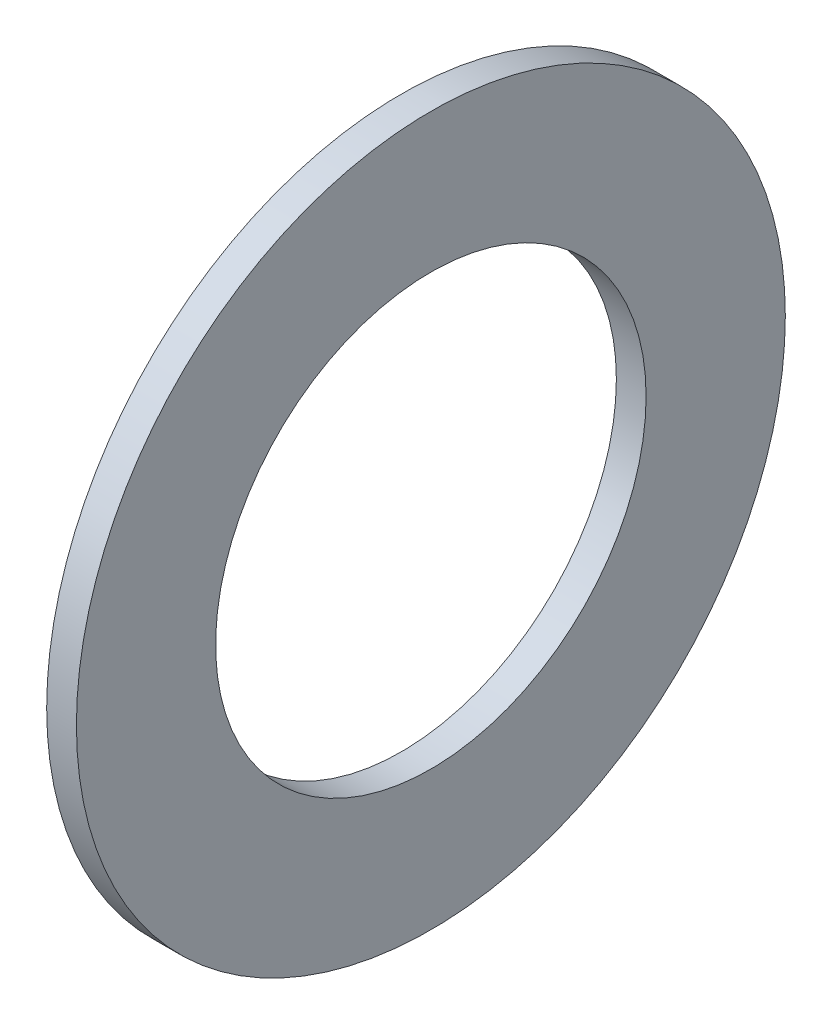
ISO-10303-21;
HEADER;
FILE_DESCRIPTION(('STEP AP214'),'2;1');
FILE_NAME('part.step','',(''),(''),'','','');
FILE_SCHEMA(('AUTOMOTIVE_DESIGN { 1 0 10303 214 1 1 1 1 }'));
ENDSEC;
DATA;
#1=APPLICATION_CONTEXT('core data for automotive mechanical design processes');
#2=APPLICATION_PROTOCOL_DEFINITION('international standard','automotive_design',2000,#1);
#3=PRODUCT_CONTEXT('',#1,'mechanical');
#4=PRODUCT('Part','Part','',(#3));
#5=PRODUCT_RELATED_PRODUCT_CATEGORY('part','',(#4));
#6=PRODUCT_DEFINITION_FORMATION('','',#4);
#7=PRODUCT_DEFINITION_CONTEXT('part definition',#1,'design');
#8=PRODUCT_DEFINITION('design','',#6,#7);
#9=PRODUCT_DEFINITION_SHAPE('','',#8);
#10=(LENGTH_UNIT() NAMED_UNIT(*) SI_UNIT(.MILLI.,.METRE.));
#11=(NAMED_UNIT(*) PLANE_ANGLE_UNIT() SI_UNIT($,.RADIAN.));
#12=(NAMED_UNIT(*) SI_UNIT($,.STERADIAN.) SOLID_ANGLE_UNIT());
#13=UNCERTAINTY_MEASURE_WITH_UNIT(LENGTH_MEASURE(1.E-05),#10,'distance_accuracy_value','');
#14=(GEOMETRIC_REPRESENTATION_CONTEXT(3) GLOBAL_UNCERTAINTY_ASSIGNED_CONTEXT((#13)) GLOBAL_UNIT_ASSIGNED_CONTEXT((#10,
#11,#12)) REPRESENTATION_CONTEXT('',''));
#15=CARTESIAN_POINT('',(0.,0.,0.));
#16=DIRECTION('',(0.,0.,1.));
#17=DIRECTION('',(1.,0.,0.));
#18=AXIS2_PLACEMENT_3D('',#15,#16,#17);
#19=CARTESIAN_POINT('',(4.,0.,0.));
#20=DIRECTION('',(1.,0.,0.));
#21=DIRECTION('',(0.,0.,-1.));
#22=AXIS2_PLACEMENT_3D('',#19,#20,#21);
#23=PLANE('',#22);
#24=CARTESIAN_POINT('',(4.,0.,0.));
#25=DIRECTION('',(1.,0.,0.));
#26=DIRECTION('',(0.,0.,-1.));
#27=AXIS2_PLACEMENT_3D('',#24,#25,#26);
#28=CIRCLE('',#27,47.675);
#29=CARTESIAN_POINT('',(4.,0.,-47.675));
#30=VERTEX_POINT('',#29);
#31=EDGE_CURVE('E10',#30,#30,#28,.T.);
#32=ORIENTED_EDGE('',*,*,#31,.T.);
#33=EDGE_LOOP('',(#32));
#34=FACE_BOUND('',#33,.T.);
#35=CARTESIAN_POINT('',(4.,0.,0.));
#36=DIRECTION('',(1.,0.,0.));
#37=DIRECTION('',(0.,0.,-1.));
#38=AXIS2_PLACEMENT_3D('',#35,#36,#37);
#39=CIRCLE('',#38,28.95);
#40=CARTESIAN_POINT('',(4.,0.,-28.95));
#41=VERTEX_POINT('',#40);
#42=EDGE_CURVE('E42',#41,#41,#39,.T.);
#43=ORIENTED_EDGE('',*,*,#42,.F.);
#44=EDGE_LOOP('',(#43));
#45=FACE_BOUND('',#44,.T.);
#46=ADVANCED_FACE('F31',(#34,#45),#23,.T.);
#47=CARTESIAN_POINT('',(0.,0.,0.));
#48=DIRECTION('',(1.,0.,0.));
#49=DIRECTION('',(0.,0.,-1.));
#50=AXIS2_PLACEMENT_3D('',#47,#48,#49);
#51=PLANE('',#50);
#52=CARTESIAN_POINT('',(0.,0.,0.));
#53=DIRECTION('',(1.,0.,0.));
#54=DIRECTION('',(0.,0.,-1.));
#55=AXIS2_PLACEMENT_3D('',#52,#53,#54);
#56=CIRCLE('',#55,47.675);
#57=CARTESIAN_POINT('',(0.,0.,-47.675));
#58=VERTEX_POINT('',#57);
#59=EDGE_CURVE('E35',#58,#58,#56,.T.);
#60=ORIENTED_EDGE('',*,*,#59,.F.);
#61=EDGE_LOOP('',(#60));
#62=FACE_BOUND('',#61,.T.);
#63=CARTESIAN_POINT('',(0.,0.,0.));
#64=DIRECTION('',(1.,0.,0.));
#65=DIRECTION('',(0.,0.,-1.));
#66=AXIS2_PLACEMENT_3D('',#63,#64,#65);
#67=CIRCLE('',#66,28.95);
#68=CARTESIAN_POINT('',(0.,0.,-28.95));
#69=VERTEX_POINT('',#68);
#70=EDGE_CURVE('E44',#69,#69,#67,.T.);
#71=ORIENTED_EDGE('',*,*,#70,.T.);
#72=EDGE_LOOP('',(#71));
#73=FACE_BOUND('',#72,.T.);
#74=ADVANCED_FACE('F54',(#62,#73),#51,.F.);
#75=CARTESIAN_POINT('',(4.,0.,0.));
#76=DIRECTION('',(-1.,0.,0.));
#77=DIRECTION('',(0.,0.,1.));
#78=AXIS2_PLACEMENT_3D('',#75,#76,#77);
#79=CYLINDRICAL_SURFACE('',#78,47.675);
#80=ORIENTED_EDGE('',*,*,#31,.F.);
#81=EDGE_LOOP('',(#80));
#82=FACE_BOUND('',#81,.T.);
#83=ORIENTED_EDGE('',*,*,#59,.T.);
#84=EDGE_LOOP('',(#83));
#85=FACE_BOUND('',#84,.T.);
#86=ADVANCED_FACE('F33',(#82,#85),#79,.T.);
#87=CARTESIAN_POINT('',(4.,0.,0.));
#88=DIRECTION('',(-1.,0.,0.));
#89=DIRECTION('',(0.,0.,1.));
#90=AXIS2_PLACEMENT_3D('',#87,#88,#89);
#91=CYLINDRICAL_SURFACE('',#90,28.95);
#92=ORIENTED_EDGE('',*,*,#42,.T.);
#93=EDGE_LOOP('',(#92));
#94=FACE_BOUND('',#93,.T.);
#95=ORIENTED_EDGE('',*,*,#70,.F.);
#96=EDGE_LOOP('',(#95));
#97=FACE_BOUND('',#96,.T.);
#98=ADVANCED_FACE('F50',(#94,#97),#91,.F.);
#99=CLOSED_SHELL('',(#46,#74,#86,#98));
#100=MANIFOLD_SOLID_BREP('B2',#99);
#101=ADVANCED_BREP_SHAPE_REPRESENTATION('',(#18,#100),#14);
#102=SHAPE_DEFINITION_REPRESENTATION(#9,#101);
ENDSEC;
END-ISO-10303-21;
